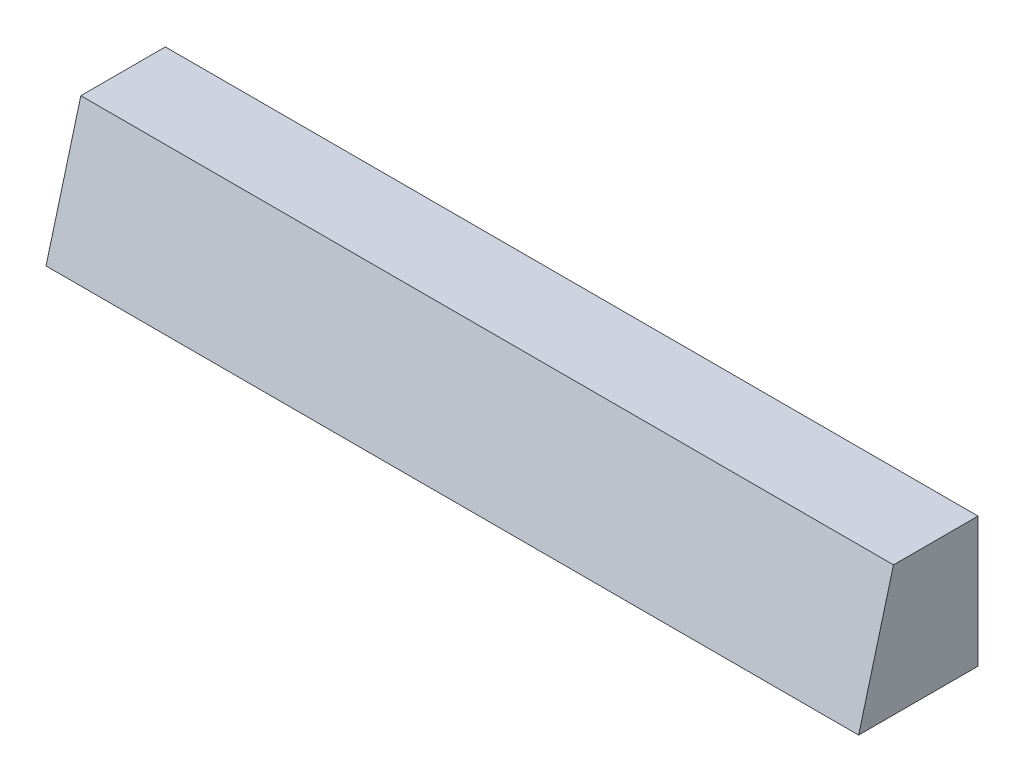
ISO-10303-21;
HEADER;
FILE_DESCRIPTION(('STEP AP214'),'2;1');
FILE_NAME('part.step','',(''),(''),'','','');
FILE_SCHEMA(('AUTOMOTIVE_DESIGN { 1 0 10303 214 1 1 1 1 }'));
ENDSEC;
DATA;
#1=APPLICATION_CONTEXT('core data for automotive mechanical design processes');
#2=APPLICATION_PROTOCOL_DEFINITION('international standard','automotive_design',2000,#1);
#3=PRODUCT_CONTEXT('',#1,'mechanical');
#4=PRODUCT('Part','Part','',(#3));
#5=PRODUCT_RELATED_PRODUCT_CATEGORY('part','',(#4));
#6=PRODUCT_DEFINITION_FORMATION('','',#4);
#7=PRODUCT_DEFINITION_CONTEXT('part definition',#1,'design');
#8=PRODUCT_DEFINITION('design','',#6,#7);
#9=PRODUCT_DEFINITION_SHAPE('','',#8);
#10=(LENGTH_UNIT() NAMED_UNIT(*) SI_UNIT(.MILLI.,.METRE.));
#11=(NAMED_UNIT(*) PLANE_ANGLE_UNIT() SI_UNIT($,.RADIAN.));
#12=(NAMED_UNIT(*) SI_UNIT($,.STERADIAN.) SOLID_ANGLE_UNIT());
#13=UNCERTAINTY_MEASURE_WITH_UNIT(LENGTH_MEASURE(1.E-05),#10,'distance_accuracy_value','');
#14=(GEOMETRIC_REPRESENTATION_CONTEXT(3) GLOBAL_UNCERTAINTY_ASSIGNED_CONTEXT((#13)) GLOBAL_UNIT_ASSIGNED_CONTEXT((#10,
#11,#12)) REPRESENTATION_CONTEXT('',''));
#15=CARTESIAN_POINT('',(0.,0.,0.));
#16=DIRECTION('',(0.,0.,1.));
#17=DIRECTION('',(1.,0.,0.));
#18=AXIS2_PLACEMENT_3D('',#15,#16,#17);
#19=CARTESIAN_POINT('',(-25.,8.,-10.));
#20=DIRECTION('',(0.,0.,1.));
#21=DIRECTION('',(1.,0.,0.));
#22=AXIS2_PLACEMENT_3D('',#19,#20,#21);
#23=PLANE('',#22);
#24=DIRECTION('',(0.,1.,0.));
#25=VECTOR('',#24,1.);
#26=CARTESIAN_POINT('',(-25.,8.,-10.));
#27=LINE('',#26,#25);
#28=CARTESIAN_POINT('',(-25.,0.,-10.));
#29=VERTEX_POINT('',#28);
#30=CARTESIAN_POINT('',(-25.,8.,-10.));
#31=VERTEX_POINT('',#30);
#32=EDGE_CURVE('E58',#29,#31,#27,.T.);
#33=ORIENTED_EDGE('',*,*,#32,.T.);
#34=DIRECTION('',(1.,0.,0.));
#35=VECTOR('',#34,1.);
#36=CARTESIAN_POINT('',(0.,8.,-10.));
#37=LINE('',#36,#35);
#38=CARTESIAN_POINT('',(25.,8.,-10.));
#39=VERTEX_POINT('',#38);
#40=EDGE_CURVE('E53',#31,#39,#37,.T.);
#41=ORIENTED_EDGE('',*,*,#40,.T.);
#42=DIRECTION('',(0.,1.,0.));
#43=VECTOR('',#42,1.);
#44=CARTESIAN_POINT('',(25.,8.,-10.));
#45=LINE('',#44,#43);
#46=CARTESIAN_POINT('',(25.,0.,-10.));
#47=VERTEX_POINT('',#46);
#48=EDGE_CURVE('E68',#39,#47,#45,.F.);
#49=ORIENTED_EDGE('',*,*,#48,.T.);
#50=DIRECTION('',(1.,0.,0.));
#51=VECTOR('',#50,1.);
#52=CARTESIAN_POINT('',(0.,0.,-10.));
#53=LINE('',#52,#51);
#54=EDGE_CURVE('E20',#29,#47,#53,.T.);
#55=ORIENTED_EDGE('',*,*,#54,.F.);
#56=EDGE_LOOP('',(#33,#41,#49,#55));
#57=FACE_BOUND('',#56,.T.);
#58=ADVANCED_FACE('F17',(#57),#23,.F.);
#59=CARTESIAN_POINT('',(0.,0.,0.));
#60=DIRECTION('',(0.,-1.,0.));
#61=DIRECTION('',(0.,0.,-1.));
#62=AXIS2_PLACEMENT_3D('',#59,#60,#61);
#63=PLANE('',#62);
#64=ORIENTED_EDGE('',*,*,#54,.T.);
#65=DIRECTION('',(0.,0.,1.));
#66=VECTOR('',#65,1.);
#67=CARTESIAN_POINT('',(25.,0.,10.));
#68=LINE('',#67,#66);
#69=CARTESIAN_POINT('',(25.,0.,-2.65640646055098));
#70=VERTEX_POINT('',#69);
#71=EDGE_CURVE('E80',#47,#70,#68,.T.);
#72=ORIENTED_EDGE('',*,*,#71,.T.);
#73=DIRECTION('',(1.,0.,0.));
#74=VECTOR('',#73,1.);
#75=CARTESIAN_POINT('',(93.053287944081,0.,-2.65640646055098));
#76=LINE('',#75,#74);
#77=CARTESIAN_POINT('',(-25.,0.,-2.65640646055098));
#78=VERTEX_POINT('',#77);
#79=EDGE_CURVE('E74',#70,#78,#76,.F.);
#80=ORIENTED_EDGE('',*,*,#79,.T.);
#81=DIRECTION('',(0.,0.,-1.));
#82=VECTOR('',#81,1.);
#83=CARTESIAN_POINT('',(-25.,0.,10.));
#84=LINE('',#83,#82);
#85=EDGE_CURVE('E63',#78,#29,#84,.T.);
#86=ORIENTED_EDGE('',*,*,#85,.T.);
#87=EDGE_LOOP('',(#64,#72,#80,#86));
#88=FACE_BOUND('',#87,.T.);
#89=ADVANCED_FACE('F73',(#88),#63,.T.);
#90=CARTESIAN_POINT('',(-25.,8.,10.));
#91=DIRECTION('',(1.,0.,0.));
#92=DIRECTION('',(0.,0.,-1.));
#93=AXIS2_PLACEMENT_3D('',#90,#91,#92);
#94=PLANE('',#93);
#95=DIRECTION('',(0.,0.965925826289067,-0.258819045102525));
#96=VECTOR('',#95,1.);
#97=CARTESIAN_POINT('',(-25.,8.,-4.8));
#98=LINE('',#97,#96);
#99=CARTESIAN_POINT('',(-25.,8.,-4.8));
#100=VERTEX_POINT('',#99);
#101=EDGE_CURVE('E84',#78,#100,#98,.T.);
#102=ORIENTED_EDGE('',*,*,#101,.T.);
#103=DIRECTION('',(0.,0.,-1.));
#104=VECTOR('',#103,1.);
#105=CARTESIAN_POINT('',(-25.,8.,0.));
#106=LINE('',#105,#104);
#107=EDGE_CURVE('E65',#100,#31,#106,.T.);
#108=ORIENTED_EDGE('',*,*,#107,.T.);
#109=ORIENTED_EDGE('',*,*,#32,.F.);
#110=ORIENTED_EDGE('',*,*,#85,.F.);
#111=EDGE_LOOP('',(#102,#108,#109,#110));
#112=FACE_BOUND('',#111,.T.);
#113=ADVANCED_FACE('F61',(#112),#94,.F.);
#114=CARTESIAN_POINT('',(0.,8.,0.));
#115=DIRECTION('',(0.,-1.,0.));
#116=DIRECTION('',(0.,0.,-1.));
#117=AXIS2_PLACEMENT_3D('',#114,#115,#116);
#118=PLANE('',#117);
#119=DIRECTION('',(1.,0.,0.));
#120=VECTOR('',#119,1.);
#121=CARTESIAN_POINT('',(93.053287944081,8.,-4.8));
#122=LINE('',#121,#120);
#123=CARTESIAN_POINT('',(25.,8.,-4.8));
#124=VERTEX_POINT('',#123);
#125=EDGE_CURVE('E26',#100,#124,#122,.T.);
#126=ORIENTED_EDGE('',*,*,#125,.T.);
#127=DIRECTION('',(0.,0.,1.));
#128=VECTOR('',#127,1.);
#129=CARTESIAN_POINT('',(25.,8.,10.));
#130=LINE('',#129,#128);
#131=EDGE_CURVE('E34',#124,#39,#130,.F.);
#132=ORIENTED_EDGE('',*,*,#131,.T.);
#133=ORIENTED_EDGE('',*,*,#40,.F.);
#134=ORIENTED_EDGE('',*,*,#107,.F.);
#135=EDGE_LOOP('',(#126,#132,#133,#134));
#136=FACE_BOUND('',#135,.T.);
#137=ADVANCED_FACE('F88',(#136),#118,.F.);
#138=CARTESIAN_POINT('',(25.,8.,10.));
#139=DIRECTION('',(-1.,0.,0.));
#140=DIRECTION('',(0.,0.,1.));
#141=AXIS2_PLACEMENT_3D('',#138,#139,#140);
#142=PLANE('',#141);
#143=DIRECTION('',(0.,0.965925826289067,-0.258819045102525));
#144=VECTOR('',#143,1.);
#145=CARTESIAN_POINT('',(25.,8.,-4.8));
#146=LINE('',#145,#144);
#147=EDGE_CURVE('E11',#124,#70,#146,.F.);
#148=ORIENTED_EDGE('',*,*,#147,.T.);
#149=ORIENTED_EDGE('',*,*,#71,.F.);
#150=ORIENTED_EDGE('',*,*,#48,.F.);
#151=ORIENTED_EDGE('',*,*,#131,.F.);
#152=EDGE_LOOP('',(#148,#149,#150,#151));
#153=FACE_BOUND('',#152,.T.);
#154=ADVANCED_FACE('F91',(#153),#142,.F.);
#155=CARTESIAN_POINT('',(93.053287944081,8.,-4.8));
#156=DIRECTION('',(0.,-0.258819045102525,-0.965925826289067));
#157=DIRECTION('',(0.,0.965925826289067,-0.258819045102525));
#158=AXIS2_PLACEMENT_3D('',#155,#156,#157);
#159=PLANE('',#158);
#160=ORIENTED_EDGE('',*,*,#125,.F.);
#161=ORIENTED_EDGE('',*,*,#101,.F.);
#162=ORIENTED_EDGE('',*,*,#79,.F.);
#163=ORIENTED_EDGE('',*,*,#147,.F.);
#164=EDGE_LOOP('',(#160,#161,#162,#163));
#165=FACE_BOUND('',#164,.T.);
#166=ADVANCED_FACE('F90',(#165),#159,.F.);
#167=CLOSED_SHELL('',(#58,#89,#113,#137,#154,#166));
#168=MANIFOLD_SOLID_BREP('B1',#167);
#169=ADVANCED_BREP_SHAPE_REPRESENTATION('',(#18,#168),#14);
#170=SHAPE_DEFINITION_REPRESENTATION(#9,#169);
ENDSEC;
END-ISO-10303-21;
